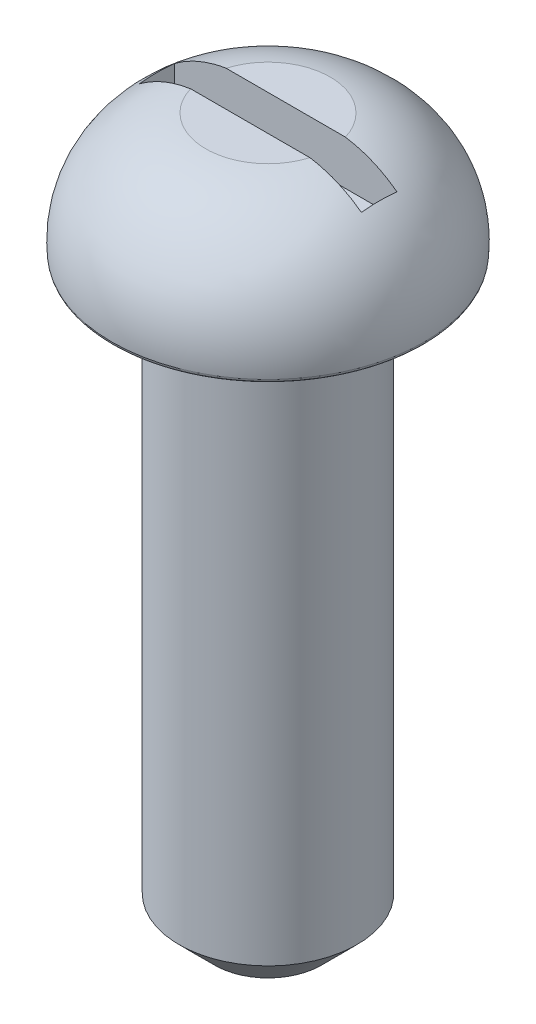
ISO-10303-21;
HEADER;
FILE_DESCRIPTION(('STEP AP214'),'2;1');
FILE_NAME('part.step','',(''),(''),'','','');
FILE_SCHEMA(('AUTOMOTIVE_DESIGN { 1 0 10303 214 1 1 1 1 }'));
ENDSEC;
DATA;
#1=APPLICATION_CONTEXT('core data for automotive mechanical design processes');
#2=APPLICATION_PROTOCOL_DEFINITION('international standard','automotive_design',2000,#1);
#3=PRODUCT_CONTEXT('',#1,'mechanical');
#4=PRODUCT('Part','Part','',(#3));
#5=PRODUCT_RELATED_PRODUCT_CATEGORY('part','',(#4));
#6=PRODUCT_DEFINITION_FORMATION('','',#4);
#7=PRODUCT_DEFINITION_CONTEXT('part definition',#1,'design');
#8=PRODUCT_DEFINITION('design','',#6,#7);
#9=PRODUCT_DEFINITION_SHAPE('','',#8);
#10=(LENGTH_UNIT() NAMED_UNIT(*) SI_UNIT(.MILLI.,.METRE.));
#11=(NAMED_UNIT(*) PLANE_ANGLE_UNIT() SI_UNIT($,.RADIAN.));
#12=(NAMED_UNIT(*) SI_UNIT($,.STERADIAN.) SOLID_ANGLE_UNIT());
#13=UNCERTAINTY_MEASURE_WITH_UNIT(LENGTH_MEASURE(1.E-05),#10,'distance_accuracy_value','');
#14=(GEOMETRIC_REPRESENTATION_CONTEXT(3) GLOBAL_UNCERTAINTY_ASSIGNED_CONTEXT((#13)) GLOBAL_UNIT_ASSIGNED_CONTEXT((#10,
#11,#12)) REPRESENTATION_CONTEXT('',''));
#15=CARTESIAN_POINT('',(0.,0.,0.));
#16=DIRECTION('',(0.,0.,1.));
#17=DIRECTION('',(1.,0.,0.));
#18=AXIS2_PLACEMENT_3D('',#15,#16,#17);
#19=CARTESIAN_POINT('',(0.,16.,0.));
#20=DIRECTION('',(0.,1.,0.));
#21=DIRECTION('',(0.,0.,1.));
#22=AXIS2_PLACEMENT_3D('',#19,#20,#21);
#23=PLANE('',#22);
#24=DIRECTION('',(-1.,0.,0.));
#25=VECTOR('',#24,1.);
#26=CARTESIAN_POINT('',(-2.5,16.,-0.4));
#27=LINE('',#26,#25);
#28=CARTESIAN_POINT('',(1.34164078649987,16.,-0.4));
#29=VERTEX_POINT('',#28);
#30=CARTESIAN_POINT('',(-1.34164078649987,16.,-0.4));
#31=VERTEX_POINT('',#30);
#32=EDGE_CURVE('E104',#29,#31,#27,.T.);
#33=ORIENTED_EDGE('',*,*,#32,.F.);
#34=CARTESIAN_POINT('',(0.,16.,0.));
#35=DIRECTION('',(0.,-1.,0.));
#36=DIRECTION('',(0.,0.,-1.));
#37=AXIS2_PLACEMENT_3D('',#34,#35,#36);
#38=CIRCLE('',#37,1.4);
#39=EDGE_CURVE('E127',#31,#29,#38,.T.);
#40=ORIENTED_EDGE('',*,*,#39,.F.);
#41=EDGE_LOOP('',(#33,#40));
#42=FACE_BOUND('',#41,.T.);
#43=ADVANCED_FACE('F28',(#42),#23,.T.);
#44=CARTESIAN_POINT('',(1.2,0.,0.));
#45=DIRECTION('',(0.,-1.,0.));
#46=DIRECTION('',(0.,0.,-1.));
#47=AXIS2_PLACEMENT_3D('',#44,#45,#46);
#48=PLANE('',#47);
#49=CARTESIAN_POINT('',(0.,0.,0.));
#50=DIRECTION('',(0.,-1.,0.));
#51=DIRECTION('',(0.,0.,-1.));
#52=AXIS2_PLACEMENT_3D('',#49,#50,#51);
#53=CIRCLE('',#52,1.2);
#54=CARTESIAN_POINT('',(0.,0.,-1.2));
#55=VERTEX_POINT('',#54);
#56=EDGE_CURVE('E114',#55,#55,#53,.T.);
#57=ORIENTED_EDGE('',*,*,#56,.T.);
#58=EDGE_LOOP('',(#57));
#59=FACE_BOUND('',#58,.T.);
#60=ADVANCED_FACE('F30',(#59),#48,.T.);
#61=DIRECTION('',(1.,0.,0.));
#62=VECTOR('',#61,1.);
#63=CARTESIAN_POINT('',(-2.5,16.,0.4));
#64=LINE('',#63,#62);
#65=CARTESIAN_POINT('',(-1.34164078649987,16.,0.4));
#66=VERTEX_POINT('',#65);
#67=CARTESIAN_POINT('',(1.34164078649987,16.,0.4));
#68=VERTEX_POINT('',#67);
#69=EDGE_CURVE('E106',#66,#68,#64,.T.);
#70=ORIENTED_EDGE('',*,*,#69,.F.);
#71=EDGE_CURVE('E130',#68,#66,#38,.T.);
#72=ORIENTED_EDGE('',*,*,#71,.F.);
#73=EDGE_LOOP('',(#70,#72));
#74=FACE_BOUND('',#73,.T.);
#75=ADVANCED_FACE('F175',(#74),#23,.T.);
#76=CARTESIAN_POINT('',(0.,13.5125,0.));
#77=DIRECTION('',(0.,-1.,0.));
#78=DIRECTION('',(0.,0.,-1.));
#79=AXIS2_PLACEMENT_3D('',#76,#77,#78);
#80=DEGENERATE_TOROIDAL_SURFACE('',#79,1.,2.5194555463433,.T.);
#81=CARTESIAN_POINT('',(0.,15.9594687881132,-0.4));
#82=CARTESIAN_POINT('',(-0.0338382677614271,15.9594721754177,-0.4));
#83=CARTESIAN_POINT('',(-0.0676779641194355,15.9605534690235,-0.4));
#84=CARTESIAN_POINT('',(-0.135250580531708,15.9645271586809,-0.4));
#85=CARTESIAN_POINT('',(-0.168983458976541,15.9674201897673,-0.4));
#86=CARTESIAN_POINT('',(-0.236586103651418,15.9742723387306,-0.4));
#87=CARTESIAN_POINT('',(-0.270455020948054,15.9782392285523,-0.4));
#88=CARTESIAN_POINT('',(-0.338156940635543,15.9864955449094,-0.4));
#89=CARTESIAN_POINT('',(-0.37198993610578,15.9907850250498,-0.4));
#90=CARTESIAN_POINT('',(-0.455604149313947,16.0010989072908,-0.4));
#91=CARTESIAN_POINT('',(-0.505403039900188,16.0069905560453,-0.4));
#92=CARTESIAN_POINT('',(-0.605160163724098,16.0172184164192,-0.4));
#93=CARTESIAN_POINT('',(-0.655118370099626,16.021554877577,-0.4));
#94=CARTESIAN_POINT('',(-0.755158183029392,16.0281116283189,-0.4));
#95=CARTESIAN_POINT('',(-0.805239724114253,16.0303328670776,-0.4));
#96=CARTESIAN_POINT('',(-0.905451481224645,16.0323446383411,-0.4));
#97=CARTESIAN_POINT('',(-0.955581698913416,16.0321350846395,-0.4));
#98=CARTESIAN_POINT('',(-1.10519744004029,16.0275826093243,-0.4));
#99=CARTESIAN_POINT('',(-1.20460157264622,16.0193672135559,-0.4));
#100=CARTESIAN_POINT('',(-1.40192321413768,15.9918916724499,-0.4));
#101=CARTESIAN_POINT('',(-1.49984015178237,15.9726273880546,-0.4));
#102=CARTESIAN_POINT('',(-1.66562418126213,15.9299930807012,-0.4));
#103=CARTESIAN_POINT('',(-1.73418957692369,15.9093063038867,-0.4));
#104=CARTESIAN_POINT('',(-1.86931661924559,15.8623062089933,-0.4));
#105=CARTESIAN_POINT('',(-1.93587915382989,15.8359954273999,-0.4));
#106=CARTESIAN_POINT('',(-2.13232230422446,15.7485950153914,-0.4));
#107=CARTESIAN_POINT('',(-2.25860062073281,15.6791290253755,-0.4));
#108=CARTESIAN_POINT('',(-2.49744991030645,15.5198455931525,-0.4));
#109=CARTESIAN_POINT('',(-2.61002524010937,15.4300346455554,-0.4));
#110=CARTESIAN_POINT('',(-2.81813579673432,15.2326675848493,-0.4));
#111=CARTESIAN_POINT('',(-2.9136919776501,15.125133611118,-0.4));
#112=CARTESIAN_POINT('',(-3.084020861249,14.8967637441041,-0.4));
#113=CARTESIAN_POINT('',(-3.15903353936495,14.7761066918437,-0.4));
#114=CARTESIAN_POINT('',(-3.28766382741801,14.5238219313858,-0.4));
#115=CARTESIAN_POINT('',(-3.34127386321256,14.3921903593208,-0.4));
#116=CARTESIAN_POINT('',(-3.42530915106019,14.1223801199839,-0.4));
#117=CARTESIAN_POINT('',(-3.45583823753319,13.984233780706,-0.4));
#118=CARTESIAN_POINT('',(-3.49323058953172,13.7047946739299,-0.4));
#119=CARTESIAN_POINT('',(-3.50009745955316,13.5635023889581,-0.4));
#120=CARTESIAN_POINT('',(-3.48998437740454,13.2819727914454,-0.4));
#121=CARTESIAN_POINT('',(-3.47303776304047,13.1417342798249,-0.4));
#122=CARTESIAN_POINT('',(-3.41583978349254,12.8660706381648,-0.4));
#123=CARTESIAN_POINT('',(-3.37558477651419,12.7306462638152,-0.4));
#124=CARTESIAN_POINT('',(-3.27291000213663,12.4684418568154,-0.4));
#125=CARTESIAN_POINT('',(-3.21048499893456,12.3416638745886,-0.4));
#126=CARTESIAN_POINT('',(-3.0652995823894,12.1004253875458,-0.4));
#127=CARTESIAN_POINT('',(-2.98254846845238,11.9859592842568,-0.4));
#128=CARTESIAN_POINT('',(-2.79895170451084,11.772356227364,-0.4));
#129=CARTESIAN_POINT('',(-2.69808464515238,11.6732376723482,-0.4));
#130=CARTESIAN_POINT('',(-2.48109536029556,11.4931192895068,-0.4));
#131=CARTESIAN_POINT('',(-2.36495283010316,11.4121439725998,-0.4));
#132=CARTESIAN_POINT('',(-2.12003686955878,11.2702055463965,-0.4));
#133=CARTESIAN_POINT('',(-1.99119324147536,11.2093628035941,-0.4));
#134=CARTESIAN_POINT('',(-1.79208455400501,11.1348165249818,-0.4));
#135=CARTESIAN_POINT('',(-1.72482351761208,11.112770190514,-0.4));
#136=CARTESIAN_POINT('',(-1.58871399977606,11.074248069245,-0.4));
#137=CARTESIAN_POINT('',(-1.51986566275127,11.0577717777811,-0.4));
#138=CARTESIAN_POINT('',(-1.37991833917445,11.0301913167248,-0.4));
#139=CARTESIAN_POINT('',(-1.30880096493828,11.0191810623686,-0.4));
#140=CARTESIAN_POINT('',(-1.16590883388619,11.0028540264086,-0.4));
#141=CARTESIAN_POINT('',(-1.09413397404904,10.9975381529959,-0.4));
#142=CARTESIAN_POINT('',(-0.950184709290669,10.9923360188387,-0.4));
#143=CARTESIAN_POINT('',(-0.878009750752937,10.9924659131582,-0.4));
#144=CARTESIAN_POINT('',(-0.733868359233081,10.9976141000356,-0.4));
#145=CARTESIAN_POINT('',(-0.661901885229666,11.0026313546615,-0.4));
#146=CARTESIAN_POINT('',(-0.527362844770217,11.0154201147344,-0.4));
#147=CARTESIAN_POINT('',(-0.464745964796631,11.0227664151523,-0.4));
#148=CARTESIAN_POINT('',(-0.370921074758583,11.0343512736872,-0.4));
#149=CARTESIAN_POINT('',(-0.339674021780255,11.0383056106516,-0.4));
#150=CARTESIAN_POINT('',(-0.277140745039576,11.0459577789511,-0.4));
#151=CARTESIAN_POINT('',(-0.245854514991186,11.0496555616753,-0.4));
#152=CARTESIAN_POINT('',(-0.183022337538647,11.0562464425247,-0.4));
#153=CARTESIAN_POINT('',(-0.151475896905263,11.0591351211382,-0.4));
#154=CARTESIAN_POINT('',(-0.0882845194117593,11.0634407062094,-0.4));
#155=CARTESIAN_POINT('',(-0.0566396201019181,11.0648581178138,-0.4));
#156=CARTESIAN_POINT('',(0.00670900055783508,11.0658228744264,-0.4));
#157=CARTESIAN_POINT('',(0.0384127491098342,11.0653686014411,-0.4));
#158=CARTESIAN_POINT('',(0.10175584896248,11.0627217036994,-0.4));
#159=CARTESIAN_POINT('',(0.133395161231609,11.0605282297223,-0.4));
#160=CARTESIAN_POINT('',(0.197075668927696,11.0549206280494,-0.4));
#161=CARTESIAN_POINT('',(0.229115032813019,11.0514872303989,-0.4));
#162=CARTESIAN_POINT('',(0.293132454280715,11.0440721569489,-0.4));
#163=CARTESIAN_POINT('',(0.325110499752555,11.0400903822904,-0.4));
#164=CARTESIAN_POINT('',(0.389068757237887,11.032113224633,-0.4));
#165=CARTESIAN_POINT('',(0.421048969104995,11.0281178401912,-0.4));
#166=CARTESIAN_POINT('',(0.485051815385008,11.0204868263651,-0.4));
#167=CARTESIAN_POINT('',(0.517074449026822,11.0168511905303,-0.4));
#168=CARTESIAN_POINT('',(0.613199905067879,11.0068908859735,-0.4));
#169=CARTESIAN_POINT('',(0.677408550694874,11.0015058987141,-0.4));
#170=CARTESIAN_POINT('',(0.806040956986531,10.9944125710688,-0.4));
#171=CARTESIAN_POINT('',(0.870464712950284,10.9927041508571,-0.4));
#172=CARTESIAN_POINT('',(0.99836221309259,10.9934918122463,-0.4));
#173=CARTESIAN_POINT('',(1.06183615678955,10.9959271498236,-0.4));
#174=CARTESIAN_POINT('',(1.18845961005121,11.0051429318533,-0.4));
#175=CARTESIAN_POINT('',(1.25160909489982,11.0119237025194,-0.4));
#176=CARTESIAN_POINT('',(1.44046174579123,11.0390588425836,-0.4));
#177=CARTESIAN_POINT('',(1.56529661737748,11.0662059685067,-0.4));
#178=CARTESIAN_POINT('',(1.75532938071435,11.1225098666057,-0.4));
#179=CARTESIAN_POINT('',(1.82244963264302,11.1454497391749,-0.400000000000001));
#180=CARTESIAN_POINT('',(1.9544668245481,11.1967759205072,-0.400000000000001));
#181=CARTESIAN_POINT('',(2.0193672489669,11.2251531837482,-0.400000000000001));
#182=CARTESIAN_POINT('',(2.14746610091274,11.287655872903,-0.400000000000001));
#183=CARTESIAN_POINT('',(2.2106280791609,11.3218560714777,-0.400000000000001));
#184=CARTESIAN_POINT('',(2.33384141088278,11.3954981556499,-0.400000000000001));
#185=CARTESIAN_POINT('',(2.39389112687907,11.4349427623866,-0.400000000000001));
#186=CARTESIAN_POINT('',(2.56822105293428,11.5604414895362,-0.400000000000001));
#187=CARTESIAN_POINT('',(2.67727417342556,11.6539498739746,-0.400000000000001));
#188=CARTESIAN_POINT('',(2.87731664505904,11.8575381230657,-0.400000000000001));
#189=CARTESIAN_POINT('',(2.96839942775862,11.967526745611,-0.400000000000001));
#190=CARTESIAN_POINT('',(3.13011034367072,12.2005805767337,-0.400000000000001));
#191=CARTESIAN_POINT('',(3.2008690104347,12.3235550656091,-0.400000000000001));
#192=CARTESIAN_POINT('',(3.32076250094825,12.5798864015786,-0.400000000000001));
#193=CARTESIAN_POINT('',(3.36985981264247,12.7132607924853,-0.400000000000001));
#194=CARTESIAN_POINT('',(3.44466082174416,12.9857648809142,-0.400000000000001));
#195=CARTESIAN_POINT('',(3.47046942013737,13.1248657895259,-0.400000000000001));
#196=CARTESIAN_POINT('',(3.49832209574621,13.4053506959011,-0.400000000000001));
#197=CARTESIAN_POINT('',(3.50037915256109,13.5467334044125,-0.400000000000001));
#198=CARTESIAN_POINT('',(3.48071400899756,13.827680796085,-0.400000000000001));
#199=CARTESIAN_POINT('',(3.45901751439648,13.9672472794955,-0.400000000000001));
#200=CARTESIAN_POINT('',(3.39249967383479,14.2407968712602,-0.400000000000001));
#201=CARTESIAN_POINT('',(3.34767190795041,14.3747784183909,-0.400000000000001));
#202=CARTESIAN_POINT('',(3.23615362082009,14.6333685749116,-0.400000000000001));
#203=CARTESIAN_POINT('',(3.16945508114511,14.7579737260251,-0.400000000000001));
#204=CARTESIAN_POINT('',(3.01616115015904,14.994170437646,-0.400000000000001));
#205=CARTESIAN_POINT('',(2.92957716226703,15.1057694015433,-0.400000000000001));
#206=CARTESIAN_POINT('',(2.73884400908251,15.3130500055761,-0.400000000000001));
#207=CARTESIAN_POINT('',(2.63467263893206,15.4087112164015,-0.400000000000001));
#208=CARTESIAN_POINT('',(2.41166340004833,15.5814542600167,-0.400000000000001));
#209=CARTESIAN_POINT('',(2.29280072738464,15.6585040042624,-0.400000000000001));
#210=CARTESIAN_POINT('',(2.04300308130581,15.7922605207593,-0.400000000000001));
#211=CARTESIAN_POINT('',(1.9119902448074,15.8488227998933,-0.4));
#212=CARTESIAN_POINT('',(1.71029562555841,15.9167355419974,-0.4));
#213=CARTESIAN_POINT('',(1.64233860502261,15.9365291975628,-0.4));
#214=CARTESIAN_POINT('',(1.50500335369698,15.970535819594,-0.4));
#215=CARTESIAN_POINT('',(1.43562462691051,15.9847468022932,-0.4));
#216=CARTESIAN_POINT('',(1.27838918164239,16.0104556218676,-0.4));
#217=CARTESIAN_POINT('',(1.19027247123466,16.0203729092839,-0.4));
#218=CARTESIAN_POINT('',(1.01355864413965,16.031745217942,-0.4));
#219=CARTESIAN_POINT('',(0.924961815219313,16.0332048448398,-0.4));
#220=CARTESIAN_POINT('',(0.791965647083485,16.0297457589619,-0.4));
#221=CARTESIAN_POINT('',(0.747467524576745,16.0276346462116,-0.4));
#222=CARTESIAN_POINT('',(0.658580235401709,16.021753448913,-0.4));
#223=CARTESIAN_POINT('',(0.614191070131046,16.0179833431949,-0.4));
#224=CARTESIAN_POINT('',(0.525521437051814,16.0091681976184,-0.4));
#225=CARTESIAN_POINT('',(0.481241040864893,16.004122470548,-0.4));
#226=CARTESIAN_POINT('',(0.392755822811415,15.9934177415786,-0.4));
#227=CARTESIAN_POINT('',(0.348551004111985,15.9877587145892,-0.4));
#228=CARTESIAN_POINT('',(0.278970443467472,15.9792802111881,-0.4));
#229=CARTESIAN_POINT('',(0.253617379606738,15.976280354131,-0.4));
#230=CARTESIAN_POINT('',(0.202862030439123,15.9707658833481,-0.4));
#231=CARTESIAN_POINT('',(0.177459757037158,15.9682511642246,-0.4));
#232=CARTESIAN_POINT('',(0.126738568217447,15.9640518042722,-0.4));
#233=CARTESIAN_POINT('',(0.10142008431906,15.9623622119908,-0.4));
#234=CARTESIAN_POINT('',(0.0507346632318588,15.9600695076987,-0.4));
#235=CARTESIAN_POINT('',(0.0253677330615122,15.9594662487327,-0.4));
#236=CARTESIAN_POINT('',(0.,15.9594687881132,-0.4));
#237=B_SPLINE_CURVE_WITH_KNOTS('',3,(#81,#82,#83,#84,#85,#86,#87,#88,#89,#90,#91,#92,#93,#94,
#95,#96,#97,#98,#99,#100,#101,#102,#103,#104,#105,#106,#107,#108,#109,#110,#111,#112,#113,#114,
#115,#116,#117,#118,#119,#120,#121,#122,#123,#124,#125,#126,#127,#128,#129,#130,#131,#132,#133,
#134,#135,#136,#137,#138,#139,#140,#141,#142,#143,#144,#145,#146,#147,#148,#149,#150,#151,#152,
#153,#154,#155,#156,#157,#158,#159,#160,#161,#162,#163,#164,#165,#166,#167,#168,#169,#170,#171,
#172,#173,#174,#175,#176,#177,#178,#179,#180,#181,#182,#183,#184,#185,#186,#187,#188,#189,#190,
#191,#192,#193,#194,#195,#196,#197,#198,#199,#200,#201,#202,#203,#204,#205,#206,#207,#208,#209,
#210,#211,#212,#213,#214,#215,#216,#217,#218,#219,#220,#221,#222,#223,#224,#225,#226,#227,#228,
#229,#230,#231,#232,#233,#234,#235,#236),.UNSPECIFIED.,.T.,.F.,(4,2,2,2,2,2,2,2,2,2,2,2,2,2,2,2,
2,2,2,2,2,2,2,2,2,2,2,2,2,2,2,2,2,2,2,2,2,2,2,2,2,2,2,2,2,2,2,2,2,2,2,2,2,2,2,2,2,2,2,2,2,2,2,2,
2,2,2,2,2,2,2,2,2,2,2,2,2,4),(0.,0.101504820932104,0.203045240398578,0.305341160156972,
0.407654116223659,0.558081783931965,0.708485303870073,0.8588213006085,1.00916262892524,
1.30776882315044,1.60648695227951,1.82109723915609,2.03561093798814,2.4657326568493,
2.89571726330221,3.32516875395587,3.74936604809478,4.17371332786318,4.59614004412969,
5.01850240874495,5.44027407379522,5.8621116558905,6.28404892806824,6.70579351796423,
7.12803984347598,7.55085321578287,7.97615061383829,8.18830163157114,8.40043342262915,
8.6160936898064,8.83178834730523,9.04812291583579,9.26441155126527,9.45352775460854,
9.54801820378475,9.64252650798969,9.73754139533282,9.83252364934071,9.92758802877956,
10.022698855065,10.1193563532496,10.2160312993006,10.3127168351883,10.4094006371196,
10.6026220243656,10.7958392163339,10.9862483442131,11.1766717678777,11.5583291965066,
11.7709265896662,11.9831733338554,12.1983855488727,12.4137098689357,12.8424067104954,
13.2688122625346,13.692414601143,14.1167476610478,14.5391596860364,14.9613408629158,
15.3830656121491,15.8049074711653,16.2269041622917,16.6486594586918,17.0709512775254,
17.4939660660107,17.9199087118788,18.1320569117541,18.3442804290728,18.6098634532941,
18.8753018395142,19.008919354105,19.1425385737906,19.2762299317647,19.4099267612036,
19.4865147484735,19.5630860779915,19.6391920897656,19.7152878054215),.UNSPECIFIED.);
#238=CARTESIAN_POINT('',(2.5,15.5128129281362,-0.400000000000001));
#239=VERTEX_POINT('',#238);
#240=EDGE_CURVE('E11',#239,#29,#237,.T.);
#241=ORIENTED_EDGE('',*,*,#240,.F.);
#242=CARTESIAN_POINT('',(2.5,15.5367668425877,0.));
#243=CARTESIAN_POINT('',(2.5,15.5367670015249,-0.091500264816902));
#244=CARTESIAN_POINT('',(2.5,15.5330519280067,-0.183007797475908));
#245=CARTESIAN_POINT('',(2.5,15.5180908020495,-0.365383970362098));
#246=CARTESIAN_POINT('',(2.5,15.5068432122217,-0.456252476337135));
#247=CARTESIAN_POINT('',(2.5,15.461362155303,-0.726544822515581));
#248=CARTESIAN_POINT('',(2.5,15.4153942264796,-0.904280473858294));
#249=CARTESIAN_POINT('',(2.5,15.3069506191006,-1.19748232639554));
#250=CARTESIAN_POINT('',(2.5,15.2530376109683,-1.31614405769195));
#251=CARTESIAN_POINT('',(2.5,15.126656167764,-1.54325305912053));
#252=CARTESIAN_POINT('',(2.5,15.0541987569766,-1.65170634576009));
#253=CARTESIAN_POINT('',(2.5,14.8902299193953,-1.8548043569158));
#254=CARTESIAN_POINT('',(2.5,14.7985618626584,-1.94932395558131));
#255=CARTESIAN_POINT('',(2.5,14.5983729261488,-2.11853619772126));
#256=CARTESIAN_POINT('',(2.5,14.4898632613297,-2.19324194635525));
#257=CARTESIAN_POINT('',(2.5,14.275575093763,-2.3097698044652));
#258=CARTESIAN_POINT('',(2.5,14.1714856021864,-2.35470691354324));
#259=CARTESIAN_POINT('',(2.5,13.9567699842453,-2.42442000934846));
#260=CARTESIAN_POINT('',(2.5,13.8461483261894,-2.44920961041039));
#261=CARTESIAN_POINT('',(2.5,13.6327053910413,-2.47608357714888));
#262=CARTESIAN_POINT('',(2.5,13.5301195153304,-2.48007087085806));
#263=CARTESIAN_POINT('',(2.5,13.3258092703255,-2.47031652720578));
#264=CARTESIAN_POINT('',(2.5,13.2240846925092,-2.45657931214316));
#265=CARTESIAN_POINT('',(2.5,13.0268160142359,-2.41248488240354));
#266=CARTESIAN_POINT('',(2.5,12.931183203771,-2.38252153712198));
#267=CARTESIAN_POINT('',(2.5,12.7460931871743,-2.30742528464294));
#268=CARTESIAN_POINT('',(2.5,12.6566363629631,-2.26229144031843));
#269=CARTESIAN_POINT('',(2.5,12.4833361297419,-2.15692413643585));
#270=CARTESIAN_POINT('',(2.5,12.3997500402724,-2.09626890754031));
#271=CARTESIAN_POINT('',(2.5,12.2429648945198,-1.96281078422356));
#272=CARTESIAN_POINT('',(2.5,12.1697680067488,-1.89000536060222));
#273=CARTESIAN_POINT('',(2.5,12.0289264329146,-1.72790867535516));
#274=CARTESIAN_POINT('',(2.5,11.9622958758047,-1.63773913873686));
#275=CARTESIAN_POINT('',(2.5,11.8427839181365,-1.44874918190837));
#276=CARTESIAN_POINT('',(2.5,11.7899107052323,-1.34992365665206));
#277=CARTESIAN_POINT('',(2.5,11.6776441076254,-1.10212490845805));
#278=CARTESIAN_POINT('',(2.5,11.6253136882517,-0.949942139465326));
#279=CARTESIAN_POINT('',(2.5,11.5459322266466,-0.639039136176456));
#280=CARTESIAN_POINT('',(2.5,11.5189387998828,-0.480304854809009));
#281=CARTESIAN_POINT('',(2.5,11.4879004512649,-0.157865091630426));
#282=CARTESIAN_POINT('',(2.5,11.4842658381049,0.00587876292039826));
#283=CARTESIAN_POINT('',(2.5,11.5006814189312,0.332122170327457));
#284=CARTESIAN_POINT('',(2.5,11.520714470928,0.49462253806139));
#285=CARTESIAN_POINT('',(2.5,11.5827239177504,0.797277045413252));
#286=CARTESIAN_POINT('',(2.5,11.6221064017617,0.937953830788707));
#287=CARTESIAN_POINT('',(2.5,11.7230465774401,1.21111704379188));
#288=CARTESIAN_POINT('',(2.5,11.7845703220912,1.34361564786348));
#289=CARTESIAN_POINT('',(2.5,11.9177233191766,1.57250786917698));
#290=CARTESIAN_POINT('',(2.5,11.985543898468,1.67110875342554));
#291=CARTESIAN_POINT('',(2.5,12.1366125292409,1.85580706618106));
#292=CARTESIAN_POINT('',(2.5,12.2198577567511,1.94190677828607));
#293=CARTESIAN_POINT('',(2.5,12.4009748654164,2.0984087573094));
#294=CARTESIAN_POINT('',(2.5,12.4989323028123,2.16871276558768));
#295=CARTESIAN_POINT('',(2.5,12.7064469321812,2.28944621439156));
#296=CARTESIAN_POINT('',(2.5,12.8159983238678,2.33988553385618));
#297=CARTESIAN_POINT('',(2.5,13.0304039926848,2.41388256230386));
#298=CARTESIAN_POINT('',(2.5,13.1344531251417,2.43978388133006));
#299=CARTESIAN_POINT('',(2.5,13.3454957286838,2.47254011541879));
#300=CARTESIAN_POINT('',(2.5,13.4524878924767,2.47940335349104));
#301=CARTESIAN_POINT('',(2.5,13.6596624673535,2.47395032082968));
#302=CARTESIAN_POINT('',(2.5,13.7598758808131,2.46273645676311));
#303=CARTESIAN_POINT('',(2.5,13.9569791779968,2.42364412292458));
#304=CARTESIAN_POINT('',(2.5,14.053869426513,2.39576748849706));
#305=CARTESIAN_POINT('',(2.5,14.2418158126943,2.32442672746202));
#306=CARTESIAN_POINT('',(2.5,14.3328658945149,2.2809467196809));
#307=CARTESIAN_POINT('',(2.5,14.5068611882592,2.18005488429901));
#308=CARTESIAN_POINT('',(2.5,14.5898051134108,2.12264084983198));
#309=CARTESIAN_POINT('',(2.5,14.7501522532948,1.99249036295088));
#310=CARTESIAN_POINT('',(2.5,14.8270218533704,1.91909863435174));
#311=CARTESIAN_POINT('',(2.5,14.9688300237409,1.76162591724045));
#312=CARTESIAN_POINT('',(2.5,15.033765096437,1.67754180733593));
#313=CARTESIAN_POINT('',(2.5,15.1579498910983,1.49117286112959));
#314=CARTESIAN_POINT('',(2.5,15.2157195955857,1.38790535829524));
#315=CARTESIAN_POINT('',(2.5,15.3162174418205,1.1743543810094));
#316=CARTESIAN_POINT('',(2.5,15.3589365686593,1.06406674821159));
#317=CARTESIAN_POINT('',(2.5,15.4430915918001,0.798248126082747));
#318=CARTESIAN_POINT('',(2.5,15.4784756070002,0.640780050388827));
#319=CARTESIAN_POINT('',(2.5,15.5135874587563,0.402013236836231));
#320=CARTESIAN_POINT('',(2.5,15.52229683123,0.321862262979064));
#321=CARTESIAN_POINT('',(2.5,15.5338856326612,0.161142655354649));
#322=CARTESIAN_POINT('',(2.5,15.5367667026293,0.0805741455554352));
#323=CARTESIAN_POINT('',(2.5,15.5367668425877,0.));
#324=B_SPLINE_CURVE_WITH_KNOTS('',3,(#242,#243,#244,#245,#246,#247,#248,#249,#250,#251,#252,
#253,#254,#255,#256,#257,#258,#259,#260,#261,#262,#263,#264,#265,#266,#267,#268,#269,#270,#271,
#272,#273,#274,#275,#276,#277,#278,#279,#280,#281,#282,#283,#284,#285,#286,#287,#288,#289,#290,
#291,#292,#293,#294,#295,#296,#297,#298,#299,#300,#301,#302,#303,#304,#305,#306,#307,#308,#309,
#310,#311,#312,#313,#314,#315,#316,#317,#318,#319,#320,#321,#322,#323),.UNSPECIFIED.,.T.,.F.,(4,
2,2,2,2,2,2,2,2,2,2,2,2,2,2,2,2,2,2,2,2,2,2,2,2,2,2,2,2,2,2,2,2,2,2,2,2,2,2,2,4),(0.,
0.274415014586531,0.548886054437859,1.09597501657236,1.48555741429441,1.87490874869223,
2.26756751275134,2.65996591542711,2.99822121841734,3.33624776067343,3.64273043744199,
3.94913666098119,4.24841843240524,4.54771869475692,4.8562256713324,5.16479694740183,
5.49982491015698,5.83505181036272,6.31520170952834,6.79644082691913,7.28611055366777,
7.77542584029954,8.21207460177579,8.64805672506248,9.00561192257923,9.36310172283598,
9.72275727557959,10.0822337409247,10.4022372415518,10.722100821967,11.0231846135131,
11.324235247868,11.6255931658266,11.9269988439299,12.2445251339688,12.5621443321505,
12.9157856276996,13.269638386591,13.7514678815871,13.9931828479188,14.2348297477626),.UNSPECIFIED.);
#325=CARTESIAN_POINT('',(2.5,15.5128129281341,0.4));
#326=VERTEX_POINT('',#325);
#327=EDGE_CURVE('E32',#326,#239,#324,.T.);
#328=ORIENTED_EDGE('',*,*,#327,.F.);
#329=CARTESIAN_POINT('',(0.,15.9594687881132,0.4));
#330=CARTESIAN_POINT('',(0.0338382677614266,15.9594721754177,0.4));
#331=CARTESIAN_POINT('',(0.0676779641194351,15.9605534690235,0.4));
#332=CARTESIAN_POINT('',(0.135250580531707,15.9645271586809,0.4));
#333=CARTESIAN_POINT('',(0.16898345897654,15.9674201897673,0.4));
#334=CARTESIAN_POINT('',(0.236586103651418,15.9742723387306,0.4));
#335=CARTESIAN_POINT('',(0.270455020948054,15.9782392285523,0.4));
#336=CARTESIAN_POINT('',(0.338156940635543,15.9864955449094,0.4));
#337=CARTESIAN_POINT('',(0.371989936105779,15.9907850250498,0.4));
#338=CARTESIAN_POINT('',(0.455604149313946,16.0010989072908,0.4));
#339=CARTESIAN_POINT('',(0.505403039900187,16.0069905560453,0.4));
#340=CARTESIAN_POINT('',(0.605160163724097,16.0172184164192,0.4));
#341=CARTESIAN_POINT('',(0.655118370099625,16.021554877577,0.4));
#342=CARTESIAN_POINT('',(0.755158183029391,16.0281116283189,0.4));
#343=CARTESIAN_POINT('',(0.805239724114252,16.0303328670776,0.4));
#344=CARTESIAN_POINT('',(0.905451481224645,16.0323446383411,0.4));
#345=CARTESIAN_POINT('',(0.955581698913415,16.0321350846395,0.4));
#346=CARTESIAN_POINT('',(1.10519744004029,16.0275826093243,0.4));
#347=CARTESIAN_POINT('',(1.20460157264622,16.0193672135559,0.4));
#348=CARTESIAN_POINT('',(1.40192321413768,15.9918916724499,0.4));
#349=CARTESIAN_POINT('',(1.49984015178237,15.9726273880546,0.4));
#350=CARTESIAN_POINT('',(1.66562418126213,15.9299930807012,0.4));
#351=CARTESIAN_POINT('',(1.73418957692369,15.9093063038867,0.4));
#352=CARTESIAN_POINT('',(1.86931661924559,15.8623062089933,0.4));
#353=CARTESIAN_POINT('',(1.93587915382989,15.8359954273999,0.4));
#354=CARTESIAN_POINT('',(2.13232230422446,15.7485950153914,0.4));
#355=CARTESIAN_POINT('',(2.25860062073281,15.6791290253755,0.4));
#356=CARTESIAN_POINT('',(2.49744991030645,15.5198455931525,0.4));
#357=CARTESIAN_POINT('',(2.61002524010937,15.4300346455554,0.4));
#358=CARTESIAN_POINT('',(2.81813579673432,15.2326675848493,0.4));
#359=CARTESIAN_POINT('',(2.9136919776501,15.125133611118,0.4));
#360=CARTESIAN_POINT('',(3.084020861249,14.8967637441041,0.4));
#361=CARTESIAN_POINT('',(3.15903353936495,14.7761066918437,0.4));
#362=CARTESIAN_POINT('',(3.28766382741801,14.5238219313858,0.4));
#363=CARTESIAN_POINT('',(3.34127386321256,14.3921903593208,0.4));
#364=CARTESIAN_POINT('',(3.42530915106019,14.1223801199838,0.4));
#365=CARTESIAN_POINT('',(3.45583823753319,13.984233780706,0.399999999999999));
#366=CARTESIAN_POINT('',(3.49323058953172,13.7047946739299,0.399999999999999));
#367=CARTESIAN_POINT('',(3.50009745955316,13.5635023889581,0.399999999999999));
#368=CARTESIAN_POINT('',(3.48998437740454,13.2819727914454,0.399999999999999));
#369=CARTESIAN_POINT('',(3.47303776304047,13.1417342798249,0.4));
#370=CARTESIAN_POINT('',(3.41583978349254,12.8660706381648,0.4));
#371=CARTESIAN_POINT('',(3.37558477651419,12.7306462638152,0.4));
#372=CARTESIAN_POINT('',(3.27291000213663,12.4684418568154,0.4));
#373=CARTESIAN_POINT('',(3.21048499893456,12.3416638745886,0.4));
#374=CARTESIAN_POINT('',(3.0652995823894,12.1004253875458,0.4));
#375=CARTESIAN_POINT('',(2.98254846845238,11.9859592842568,0.4));
#376=CARTESIAN_POINT('',(2.79895170451084,11.772356227364,0.4));
#377=CARTESIAN_POINT('',(2.69808464515238,11.6732376723482,0.4));
#378=CARTESIAN_POINT('',(2.48109536029556,11.4931192895068,0.4));
#379=CARTESIAN_POINT('',(2.36495283010316,11.4121439725998,0.4));
#380=CARTESIAN_POINT('',(2.12003686955878,11.2702055463965,0.4));
#381=CARTESIAN_POINT('',(1.99119324147536,11.2093628035941,0.4));
#382=CARTESIAN_POINT('',(1.79208455400501,11.1348165249818,0.4));
#383=CARTESIAN_POINT('',(1.72482351761208,11.112770190514,0.4));
#384=CARTESIAN_POINT('',(1.58871399977606,11.074248069245,0.4));
#385=CARTESIAN_POINT('',(1.51986566275127,11.0577717777811,0.4));
#386=CARTESIAN_POINT('',(1.37991833917445,11.0301913167248,0.4));
#387=CARTESIAN_POINT('',(1.30880096493828,11.0191810623686,0.4));
#388=CARTESIAN_POINT('',(1.16590883388619,11.0028540264086,0.4));
#389=CARTESIAN_POINT('',(1.09413397404904,10.9975381529959,0.4));
#390=CARTESIAN_POINT('',(0.950184709290667,10.9923360188387,0.4));
#391=CARTESIAN_POINT('',(0.878009750752936,10.9924659131582,0.4));
#392=CARTESIAN_POINT('',(0.733868359233081,10.9976141000356,0.4));
#393=CARTESIAN_POINT('',(0.661901885229666,11.0026313546615,0.4));
#394=CARTESIAN_POINT('',(0.527362844770217,11.0154201147344,0.4));
#395=CARTESIAN_POINT('',(0.46474596479663,11.0227664151523,0.4));
#396=CARTESIAN_POINT('',(0.370921074758583,11.0343512736872,0.4));
#397=CARTESIAN_POINT('',(0.339674021780254,11.0383056106516,0.4));
#398=CARTESIAN_POINT('',(0.277140745039576,11.0459577789511,0.4));
#399=CARTESIAN_POINT('',(0.245854514991185,11.0496555616753,0.4));
#400=CARTESIAN_POINT('',(0.183022337538647,11.0562464425247,0.4));
#401=CARTESIAN_POINT('',(0.151475896905263,11.0591351211382,0.4));
#402=CARTESIAN_POINT('',(0.0882845194117591,11.0634407062094,0.4));
#403=CARTESIAN_POINT('',(0.0566396201019179,11.0648581178138,0.4));
#404=CARTESIAN_POINT('',(-0.0067090005578355,11.0658228744264,0.4));
#405=CARTESIAN_POINT('',(-0.0384127491098349,11.0653686014411,0.4));
#406=CARTESIAN_POINT('',(-0.101755848962481,11.0627217036994,0.4));
#407=CARTESIAN_POINT('',(-0.13339516123161,11.0605282297223,0.4));
#408=CARTESIAN_POINT('',(-0.197075668927696,11.0549206280494,0.4));
#409=CARTESIAN_POINT('',(-0.22911503281302,11.0514872303989,0.4));
#410=CARTESIAN_POINT('',(-0.293132454280717,11.0440721569489,0.4));
#411=CARTESIAN_POINT('',(-0.325110499752556,11.0400903822904,0.4));
#412=CARTESIAN_POINT('',(-0.389068757237889,11.032113224633,0.4));
#413=CARTESIAN_POINT('',(-0.421048969104997,11.0281178401912,0.4));
#414=CARTESIAN_POINT('',(-0.485051815385009,11.0204868263651,0.4));
#415=CARTESIAN_POINT('',(-0.517074449026823,11.0168511905303,0.4));
#416=CARTESIAN_POINT('',(-0.613199905067879,11.0068908859735,0.4));
#417=CARTESIAN_POINT('',(-0.677408550694873,11.0015058987141,0.4));
#418=CARTESIAN_POINT('',(-0.80604095698653,10.9944125710688,0.4));
#419=CARTESIAN_POINT('',(-0.870464712950283,10.9927041508571,0.4));
#420=CARTESIAN_POINT('',(-0.998362213092589,10.9934918122463,0.4));
#421=CARTESIAN_POINT('',(-1.06183615678955,10.9959271498236,0.4));
#422=CARTESIAN_POINT('',(-1.18845961005121,11.0051429318533,0.4));
#423=CARTESIAN_POINT('',(-1.25160909489982,11.0119237025194,0.4));
#424=CARTESIAN_POINT('',(-1.44046174579123,11.0390588425836,0.4));
#425=CARTESIAN_POINT('',(-1.56529661737748,11.0662059685067,0.4));
#426=CARTESIAN_POINT('',(-1.75532938071435,11.1225098666057,0.4));
#427=CARTESIAN_POINT('',(-1.82244963264302,11.1454497391749,0.4));
#428=CARTESIAN_POINT('',(-1.9544668245481,11.1967759205072,0.4));
#429=CARTESIAN_POINT('',(-2.0193672489669,11.2251531837482,0.4));
#430=CARTESIAN_POINT('',(-2.14746610091274,11.287655872903,0.4));
#431=CARTESIAN_POINT('',(-2.2106280791609,11.3218560714777,0.4));
#432=CARTESIAN_POINT('',(-2.33384141088278,11.3954981556499,0.4));
#433=CARTESIAN_POINT('',(-2.39389112687907,11.4349427623866,0.4));
#434=CARTESIAN_POINT('',(-2.56822105293428,11.5604414895362,0.4));
#435=CARTESIAN_POINT('',(-2.67727417342556,11.6539498739746,0.4));
#436=CARTESIAN_POINT('',(-2.87731664505904,11.8575381230657,0.4));
#437=CARTESIAN_POINT('',(-2.96839942775861,11.967526745611,0.4));
#438=CARTESIAN_POINT('',(-3.13011034367072,12.2005805767337,0.4));
#439=CARTESIAN_POINT('',(-3.2008690104347,12.3235550656091,0.4));
#440=CARTESIAN_POINT('',(-3.32076250094825,12.5798864015786,0.4));
#441=CARTESIAN_POINT('',(-3.36985981264247,12.7132607924853,0.4));
#442=CARTESIAN_POINT('',(-3.44466082174416,12.9857648809142,0.4));
#443=CARTESIAN_POINT('',(-3.47046942013737,13.1248657895259,0.400000000000001));
#444=CARTESIAN_POINT('',(-3.49832209574621,13.4053506959011,0.400000000000001));
#445=CARTESIAN_POINT('',(-3.50037915256109,13.5467334044125,0.400000000000001));
#446=CARTESIAN_POINT('',(-3.48071400899756,13.827680796085,0.400000000000001));
#447=CARTESIAN_POINT('',(-3.45901751439648,13.9672472794955,0.4));
#448=CARTESIAN_POINT('',(-3.39249967383479,14.2407968712602,0.4));
#449=CARTESIAN_POINT('',(-3.34767190795041,14.3747784183909,0.4));
#450=CARTESIAN_POINT('',(-3.2361536208201,14.6333685749116,0.4));
#451=CARTESIAN_POINT('',(-3.16945508114511,14.7579737260251,0.4));
#452=CARTESIAN_POINT('',(-3.01616115015904,14.9941704376459,0.4));
#453=CARTESIAN_POINT('',(-2.92957716226703,15.1057694015433,0.4));
#454=CARTESIAN_POINT('',(-2.73884400908251,15.3130500055761,0.4));
#455=CARTESIAN_POINT('',(-2.63467263893207,15.4087112164015,0.4));
#456=CARTESIAN_POINT('',(-2.41166340004833,15.5814542600167,0.4));
#457=CARTESIAN_POINT('',(-2.29280072738464,15.6585040042624,0.4));
#458=CARTESIAN_POINT('',(-2.04300308130581,15.7922605207593,0.4));
#459=CARTESIAN_POINT('',(-1.9119902448074,15.8488227998933,0.4));
#460=CARTESIAN_POINT('',(-1.71029562555841,15.9167355419974,0.4));
#461=CARTESIAN_POINT('',(-1.64233860502261,15.9365291975628,0.4));
#462=CARTESIAN_POINT('',(-1.50500335369698,15.970535819594,0.4));
#463=CARTESIAN_POINT('',(-1.43562462691051,15.9847468022932,0.4));
#464=CARTESIAN_POINT('',(-1.2783891816424,16.0104556218676,0.4));
#465=CARTESIAN_POINT('',(-1.19027247123467,16.0203729092839,0.4));
#466=CARTESIAN_POINT('',(-1.01355864413965,16.031745217942,0.4));
#467=CARTESIAN_POINT('',(-0.924961815219317,16.0332048448398,0.4));
#468=CARTESIAN_POINT('',(-0.791965647083489,16.0297457589619,0.4));
#469=CARTESIAN_POINT('',(-0.747467524576749,16.0276346462116,0.4));
#470=CARTESIAN_POINT('',(-0.658580235401713,16.021753448913,0.4));
#471=CARTESIAN_POINT('',(-0.61419107013105,16.0179833431949,0.4));
#472=CARTESIAN_POINT('',(-0.525521437051817,16.0091681976184,0.4));
#473=CARTESIAN_POINT('',(-0.481241040864897,16.004122470548,0.4));
#474=CARTESIAN_POINT('',(-0.392755822811418,15.9934177415786,0.4));
#475=CARTESIAN_POINT('',(-0.348551004111988,15.9877587145892,0.4));
#476=CARTESIAN_POINT('',(-0.278970443467475,15.9792802111881,0.4));
#477=CARTESIAN_POINT('',(-0.253617379606741,15.976280354131,0.4));
#478=CARTESIAN_POINT('',(-0.202862030439126,15.9707658833481,0.4));
#479=CARTESIAN_POINT('',(-0.177459757037161,15.9682511642246,0.4));
#480=CARTESIAN_POINT('',(-0.126738568217449,15.9640518042722,0.4));
#481=CARTESIAN_POINT('',(-0.101420084319061,15.9623622119908,0.4));
#482=CARTESIAN_POINT('',(-0.0507346632318591,15.9600695076987,0.4));
#483=CARTESIAN_POINT('',(-0.0253677330615125,15.9594662487327,0.4));
#484=CARTESIAN_POINT('',(0.,15.9594687881132,0.4));
#485=B_SPLINE_CURVE_WITH_KNOTS('',3,(#329,#330,#331,#332,#333,#334,#335,#336,#337,#338,#339,
#340,#341,#342,#343,#344,#345,#346,#347,#348,#349,#350,#351,#352,#353,#354,#355,#356,#357,#358,
#359,#360,#361,#362,#363,#364,#365,#366,#367,#368,#369,#370,#371,#372,#373,#374,#375,#376,#377,
#378,#379,#380,#381,#382,#383,#384,#385,#386,#387,#388,#389,#390,#391,#392,#393,#394,#395,#396,
#397,#398,#399,#400,#401,#402,#403,#404,#405,#406,#407,#408,#409,#410,#411,#412,#413,#414,#415,
#416,#417,#418,#419,#420,#421,#422,#423,#424,#425,#426,#427,#428,#429,#430,#431,#432,#433,#434,
#435,#436,#437,#438,#439,#440,#441,#442,#443,#444,#445,#446,#447,#448,#449,#450,#451,#452,#453,
#454,#455,#456,#457,#458,#459,#460,#461,#462,#463,#464,#465,#466,#467,#468,#469,#470,#471,#472,
#473,#474,#475,#476,#477,#478,#479,#480,#481,#482,#483,#484),.UNSPECIFIED.,.T.,.F.,(4,2,2,2,2,2,
2,2,2,2,2,2,2,2,2,2,2,2,2,2,2,2,2,2,2,2,2,2,2,2,2,2,2,2,2,2,2,2,2,2,2,2,2,2,2,2,2,2,2,2,2,2,2,2,
2,2,2,2,2,2,2,2,2,2,2,2,2,2,2,2,2,2,2,2,2,2,2,4),(0.,0.101504820932103,0.203045240398578,
0.305341160156973,0.407654116223659,0.558081783931964,0.708485303870073,0.8588213006085,
1.00916262892524,1.30776882315044,1.60648695227951,1.82109723915609,2.03561093798814,
2.4657326568493,2.89571726330221,3.32516875395587,3.74936604809479,4.17371332786318,
4.5961400441297,5.01850240874495,5.44027407379522,5.8621116558905,6.28404892806824,
6.70579351796423,7.12803984347598,7.55085321578287,7.97615061383829,8.18830163157114,
8.40043342262916,8.6160936898064,8.83178834730523,9.04812291583579,9.26441155126527,
9.45352775460854,9.54801820378475,9.64252650798969,9.73754139533282,9.83252364934071,
9.92758802877956,10.022698855065,10.1193563532496,10.2160312993006,10.3127168351883,
10.4094006371196,10.6026220243656,10.7958392163339,10.9862483442131,11.1766717678777,
11.5583291965066,11.7709265896662,11.9831733338554,12.1983855488727,12.4137098689357,
12.8424067104954,13.2688122625346,13.692414601143,14.1167476610478,14.5391596860364,
14.9613408629158,15.3830656121491,15.8049074711653,16.2269041622917,16.6486594586918,
17.0709512775254,17.4939660660107,17.9199087118788,18.1320569117541,18.3442804290728,
18.609863453294,18.8753018395141,19.008919354105,19.1425385737906,19.2762299317647,
19.4099267612036,19.4865147484735,19.5630860779915,19.6391920897656,19.7152878054215),.UNSPECIFIED.);
#486=EDGE_CURVE('E142',#68,#326,#485,.T.);
#487=ORIENTED_EDGE('',*,*,#486,.F.);
#488=ORIENTED_EDGE('',*,*,#71,.T.);
#489=CARTESIAN_POINT('',(-2.50000000000001,15.5128129281362,0.4));
#490=VERTEX_POINT('',#489);
#491=EDGE_CURVE('E137',#490,#66,#485,.T.);
#492=ORIENTED_EDGE('',*,*,#491,.F.);
#493=CARTESIAN_POINT('',(-2.5,15.5367668425877,0.));
#494=CARTESIAN_POINT('',(-2.5,15.5367670015249,0.0915002648169016));
#495=CARTESIAN_POINT('',(-2.5,15.5330519280067,0.183007797475908));
#496=CARTESIAN_POINT('',(-2.5,15.5180908020495,0.365383970362097));
#497=CARTESIAN_POINT('',(-2.5,15.5068432122217,0.456252476337135));
#498=CARTESIAN_POINT('',(-2.5,15.461362155303,0.72654482251558));
#499=CARTESIAN_POINT('',(-2.5,15.4153942264796,0.904280473858293));
#500=CARTESIAN_POINT('',(-2.5,15.3069506191006,1.19748232639554));
#501=CARTESIAN_POINT('',(-2.5,15.2530376109683,1.31614405769195));
#502=CARTESIAN_POINT('',(-2.5,15.126656167764,1.54325305912053));
#503=CARTESIAN_POINT('',(-2.5,15.0541987569766,1.65170634576009));
#504=CARTESIAN_POINT('',(-2.5,14.8902299193953,1.8548043569158));
#505=CARTESIAN_POINT('',(-2.5,14.7985618626584,1.94932395558131));
#506=CARTESIAN_POINT('',(-2.5,14.5983729261488,2.11853619772125));
#507=CARTESIAN_POINT('',(-2.5,14.4898632613297,2.19324194635524));
#508=CARTESIAN_POINT('',(-2.5,14.275575093763,2.30976980446519));
#509=CARTESIAN_POINT('',(-2.5,14.1714856021864,2.35470691354324));
#510=CARTESIAN_POINT('',(-2.5,13.9567699842453,2.42442000934845));
#511=CARTESIAN_POINT('',(-2.5,13.8461483261894,2.44920961041039));
#512=CARTESIAN_POINT('',(-2.5,13.6327053910413,2.47608357714888));
#513=CARTESIAN_POINT('',(-2.5,13.5301195153304,2.48007087085806));
#514=CARTESIAN_POINT('',(-2.5,13.3258092703255,2.47031652720577));
#515=CARTESIAN_POINT('',(-2.5,13.2240846925092,2.45657931214316));
#516=CARTESIAN_POINT('',(-2.5,13.0268160142359,2.41248488240354));
#517=CARTESIAN_POINT('',(-2.5,12.931183203771,2.38252153712198));
#518=CARTESIAN_POINT('',(-2.5,12.7460931871743,2.30742528464294));
#519=CARTESIAN_POINT('',(-2.5,12.6566363629631,2.26229144031843));
#520=CARTESIAN_POINT('',(-2.5,12.4833361297419,2.15692413643585));
#521=CARTESIAN_POINT('',(-2.5,12.3997500402724,2.09626890754031));
#522=CARTESIAN_POINT('',(-2.5,12.2429648945198,1.96281078422355));
#523=CARTESIAN_POINT('',(-2.5,12.1697680067488,1.89000536060222));
#524=CARTESIAN_POINT('',(-2.5,12.0289264329146,1.72790867535516));
#525=CARTESIAN_POINT('',(-2.5,11.9622958758047,1.63773913873686));
#526=CARTESIAN_POINT('',(-2.5,11.8427839181365,1.44874918190837));
#527=CARTESIAN_POINT('',(-2.5,11.7899107052323,1.34992365665206));
#528=CARTESIAN_POINT('',(-2.5,11.6776441076254,1.10212490845805));
#529=CARTESIAN_POINT('',(-2.5,11.6253136882517,0.949942139465325));
#530=CARTESIAN_POINT('',(-2.5,11.5459322266466,0.639039136176455));
#531=CARTESIAN_POINT('',(-2.5,11.5189387998828,0.480304854809008));
#532=CARTESIAN_POINT('',(-2.5,11.4879004512649,0.157865091630424));
#533=CARTESIAN_POINT('',(-2.5,11.4842658381049,-0.00587876292039986));
#534=CARTESIAN_POINT('',(-2.5,11.5006814189312,-0.332122170327459));
#535=CARTESIAN_POINT('',(-2.5,11.520714470928,-0.494622538061392));
#536=CARTESIAN_POINT('',(-2.5,11.5827239177504,-0.797277045413254));
#537=CARTESIAN_POINT('',(-2.5,11.6221064017617,-0.937953830788709));
#538=CARTESIAN_POINT('',(-2.5,11.7230465774401,-1.21111704379188));
#539=CARTESIAN_POINT('',(-2.5,11.7845703220912,-1.34361564786348));
#540=CARTESIAN_POINT('',(-2.5,11.9177233191766,-1.57250786917698));
#541=CARTESIAN_POINT('',(-2.5,11.985543898468,-1.67110875342554));
#542=CARTESIAN_POINT('',(-2.5,12.1366125292409,-1.85580706618106));
#543=CARTESIAN_POINT('',(-2.5,12.2198577567511,-1.94190677828607));
#544=CARTESIAN_POINT('',(-2.5,12.4009748654164,-2.09840875730939));
#545=CARTESIAN_POINT('',(-2.5,12.4989323028123,-2.16871276558768));
#546=CARTESIAN_POINT('',(-2.5,12.7064469321812,-2.28944621439156));
#547=CARTESIAN_POINT('',(-2.5,12.8159983238678,-2.33988553385618));
#548=CARTESIAN_POINT('',(-2.5,13.0304039926848,-2.41388256230386));
#549=CARTESIAN_POINT('',(-2.5,13.1344531251417,-2.43978388133006));
#550=CARTESIAN_POINT('',(-2.5,13.3454957286838,-2.47254011541879));
#551=CARTESIAN_POINT('',(-2.5,13.4524878924767,-2.47940335349104));
#552=CARTESIAN_POINT('',(-2.5,13.6596624673535,-2.47395032082968));
#553=CARTESIAN_POINT('',(-2.5,13.7598758808131,-2.46273645676311));
#554=CARTESIAN_POINT('',(-2.5,13.9569791779968,-2.42364412292458));
#555=CARTESIAN_POINT('',(-2.5,14.053869426513,-2.39576748849706));
#556=CARTESIAN_POINT('',(-2.5,14.2418158126943,-2.32442672746202));
#557=CARTESIAN_POINT('',(-2.5,14.3328658945149,-2.2809467196809));
#558=CARTESIAN_POINT('',(-2.5,14.5068611882592,-2.18005488429901));
#559=CARTESIAN_POINT('',(-2.5,14.5898051134108,-2.12264084983198));
#560=CARTESIAN_POINT('',(-2.5,14.7501522532948,-1.99249036295088));
#561=CARTESIAN_POINT('',(-2.5,14.8270218533704,-1.91909863435175));
#562=CARTESIAN_POINT('',(-2.5,14.9688300237409,-1.76162591724046));
#563=CARTESIAN_POINT('',(-2.5,15.033765096437,-1.67754180733593));
#564=CARTESIAN_POINT('',(-2.5,15.1579498910983,-1.4911728611296));
#565=CARTESIAN_POINT('',(-2.5,15.2157195955857,-1.38790535829525));
#566=CARTESIAN_POINT('',(-2.5,15.3162174418205,-1.1743543810094));
#567=CARTESIAN_POINT('',(-2.5,15.3589365686593,-1.06406674821159));
#568=CARTESIAN_POINT('',(-2.5,15.4430915918001,-0.798248126082748));
#569=CARTESIAN_POINT('',(-2.5,15.4784756070002,-0.640780050388828));
#570=CARTESIAN_POINT('',(-2.5,15.5135874587563,-0.402013236836232));
#571=CARTESIAN_POINT('',(-2.5,15.52229683123,-0.321862262979064));
#572=CARTESIAN_POINT('',(-2.5,15.5338856326612,-0.16114265535465));
#573=CARTESIAN_POINT('',(-2.5,15.5367667026293,-0.0805741455554355));
#574=CARTESIAN_POINT('',(-2.5,15.5367668425877,0.));
#575=B_SPLINE_CURVE_WITH_KNOTS('',3,(#493,#494,#495,#496,#497,#498,#499,#500,#501,#502,#503,
#504,#505,#506,#507,#508,#509,#510,#511,#512,#513,#514,#515,#516,#517,#518,#519,#520,#521,#522,
#523,#524,#525,#526,#527,#528,#529,#530,#531,#532,#533,#534,#535,#536,#537,#538,#539,#540,#541,
#542,#543,#544,#545,#546,#547,#548,#549,#550,#551,#552,#553,#554,#555,#556,#557,#558,#559,#560,
#561,#562,#563,#564,#565,#566,#567,#568,#569,#570,#571,#572,#573,#574),.UNSPECIFIED.,.T.,.F.,(4,
2,2,2,2,2,2,2,2,2,2,2,2,2,2,2,2,2,2,2,2,2,2,2,2,2,2,2,2,2,2,2,2,2,2,2,2,2,2,2,4),(0.,
0.27441501458653,0.548886054437859,1.09597501657236,1.48555741429441,1.87490874869223,
2.26756751275134,2.65996591542711,2.99822121841734,3.33624776067343,3.64273043744199,
3.94913666098119,4.24841843240524,4.54771869475692,4.8562256713324,5.16479694740183,
5.49982491015698,5.83505181036272,6.31520170952833,6.79644082691913,7.28611055366777,
7.77542584029954,8.21207460177579,8.64805672506248,9.00561192257922,9.36310172283597,
9.72275727557959,10.0822337409247,10.4022372415518,10.722100821967,11.0231846135131,
11.324235247868,11.6255931658266,11.9269988439299,12.2445251339687,12.5621443321505,
12.9157856276995,13.269638386591,13.7514678815871,13.9931828479188,14.2348297477626),.UNSPECIFIED.);
#576=CARTESIAN_POINT('',(-2.5,15.5128129281341,-0.4));
#577=VERTEX_POINT('',#576);
#578=EDGE_CURVE('E88',#577,#490,#575,.T.);
#579=ORIENTED_EDGE('',*,*,#578,.F.);
#580=EDGE_CURVE('E41',#31,#577,#237,.T.);
#581=ORIENTED_EDGE('',*,*,#580,.F.);
#582=ORIENTED_EDGE('',*,*,#39,.T.);
#583=EDGE_LOOP('',(#241,#328,#487,#488,#492,#579,#581,#582));
#584=FACE_BOUND('',#583,.T.);
#585=CARTESIAN_POINT('',(0.,13.2912170322649,0.));
#586=DIRECTION('',(0.,1.,0.));
#587=DIRECTION('',(0.,0.,1.));
#588=AXIS2_PLACEMENT_3D('',#585,#586,#587);
#589=CIRCLE('',#588,3.50971912735078);
#590=CARTESIAN_POINT('',(0.,13.2912170322649,3.50971912735078));
#591=VERTEX_POINT('',#590);
#592=EDGE_CURVE('E134',#591,#591,#589,.T.);
#593=ORIENTED_EDGE('',*,*,#592,.T.);
#594=EDGE_LOOP('',(#593));
#595=FACE_BOUND('',#594,.T.);
#596=ADVANCED_FACE('F146',(#584,#595),#80,.T.);
#597=CARTESIAN_POINT('',(3.5,13.2,0.));
#598=DIRECTION('',(0.,-1.,0.));
#599=DIRECTION('',(0.,0.,-1.));
#600=AXIS2_PLACEMENT_3D('',#597,#598,#599);
#601=PLANE('',#600);
#602=CARTESIAN_POINT('',(0.,13.2,0.));
#603=DIRECTION('',(0.,-1.,0.));
#604=DIRECTION('',(0.,0.,-1.));
#605=AXIS2_PLACEMENT_3D('',#602,#603,#604);
#606=CIRCLE('',#605,3.41010557667737);
#607=CARTESIAN_POINT('',(0.,13.2,-3.41010557667737));
#608=VERTEX_POINT('',#607);
#609=EDGE_CURVE('E131',#608,#608,#606,.T.);
#610=ORIENTED_EDGE('',*,*,#609,.T.);
#611=EDGE_LOOP('',(#610));
#612=FACE_BOUND('',#611,.T.);
#613=CARTESIAN_POINT('',(0.,13.2,0.));
#614=DIRECTION('',(0.,-1.,0.));
#615=DIRECTION('',(0.,0.,-1.));
#616=AXIS2_PLACEMENT_3D('',#613,#614,#615);
#617=CIRCLE('',#616,2.);
#618=CARTESIAN_POINT('',(0.,13.2,-2.));
#619=VERTEX_POINT('',#618);
#620=EDGE_CURVE('E124',#619,#619,#617,.T.);
#621=ORIENTED_EDGE('',*,*,#620,.F.);
#622=EDGE_LOOP('',(#621));
#623=FACE_BOUND('',#622,.T.);
#624=ADVANCED_FACE('F168',(#612,#623),#601,.T.);
#625=CARTESIAN_POINT('',(0.,0.,0.));
#626=DIRECTION('',(0.,-1.,0.));
#627=DIRECTION('',(0.,0.,-1.));
#628=AXIS2_PLACEMENT_3D('',#625,#626,#627);
#629=CYLINDRICAL_SURFACE('',#628,2.);
#630=ORIENTED_EDGE('',*,*,#620,.T.);
#631=EDGE_LOOP('',(#630));
#632=FACE_BOUND('',#631,.T.);
#633=CARTESIAN_POINT('',(0.,0.800000000000005,0.));
#634=DIRECTION('',(0.,-1.,0.));
#635=DIRECTION('',(0.,0.,-1.));
#636=AXIS2_PLACEMENT_3D('',#633,#634,#635);
#637=CIRCLE('',#636,2.);
#638=CARTESIAN_POINT('',(0.,0.800000000000005,-2.));
#639=VERTEX_POINT('',#638);
#640=EDGE_CURVE('E121',#639,#639,#637,.T.);
#641=ORIENTED_EDGE('',*,*,#640,.F.);
#642=EDGE_LOOP('',(#641));
#643=FACE_BOUND('',#642,.T.);
#644=ADVANCED_FACE('F165',(#632,#643),#629,.T.);
#645=CARTESIAN_POINT('',(0.,0.,0.));
#646=DIRECTION('',(0.,1.,0.));
#647=DIRECTION('',(0.,0.,1.));
#648=AXIS2_PLACEMENT_3D('',#645,#646,#647);
#649=CONICAL_SURFACE('',#648,1.2,0.785398163397446);
#650=ORIENTED_EDGE('',*,*,#640,.T.);
#651=EDGE_LOOP('',(#650));
#652=FACE_BOUND('',#651,.T.);
#653=ORIENTED_EDGE('',*,*,#56,.F.);
#654=EDGE_LOOP('',(#653));
#655=FACE_BOUND('',#654,.T.);
#656=ADVANCED_FACE('F161',(#652,#655),#649,.T.);
#657=CARTESIAN_POINT('',(0.,13.3,0.));
#658=DIRECTION('',(0.,-1.,0.));
#659=DIRECTION('',(0.,0.,-1.));
#660=AXIS2_PLACEMENT_3D('',#657,#658,#659);
#661=TOROIDAL_SURFACE('',#660,3.41010557667737,0.1);
#662=ORIENTED_EDGE('',*,*,#592,.F.);
#663=EDGE_LOOP('',(#662));
#664=FACE_BOUND('',#663,.T.);
#665=ORIENTED_EDGE('',*,*,#609,.F.);
#666=EDGE_LOOP('',(#665));
#667=FACE_BOUND('',#666,.T.);
#668=ADVANCED_FACE('F158',(#664,#667),#661,.T.);
#669=CARTESIAN_POINT('',(-2.5,15.,-0.4));
#670=DIRECTION('',(-1.,0.,0.));
#671=DIRECTION('',(0.,0.,1.));
#672=AXIS2_PLACEMENT_3D('',#669,#670,#671);
#673=PLANE('',#672);
#674=ORIENTED_EDGE('',*,*,#578,.T.);
#675=DIRECTION('',(0.,1.,0.));
#676=VECTOR('',#675,1.);
#677=CARTESIAN_POINT('',(-2.5,15.,0.4));
#678=LINE('',#677,#676);
#679=CARTESIAN_POINT('',(-2.5,15.,0.4));
#680=VERTEX_POINT('',#679);
#681=EDGE_CURVE('E48',#680,#490,#678,.T.);
#682=ORIENTED_EDGE('',*,*,#681,.F.);
#683=DIRECTION('',(0.,0.,1.));
#684=VECTOR('',#683,1.);
#685=CARTESIAN_POINT('',(-2.5,15.,-0.4));
#686=LINE('',#685,#684);
#687=CARTESIAN_POINT('',(-2.5,15.,-0.4));
#688=VERTEX_POINT('',#687);
#689=EDGE_CURVE('E85',#688,#680,#686,.T.);
#690=ORIENTED_EDGE('',*,*,#689,.F.);
#691=DIRECTION('',(0.,1.,0.));
#692=VECTOR('',#691,1.);
#693=CARTESIAN_POINT('',(-2.5,15.,-0.4));
#694=LINE('',#693,#692);
#695=EDGE_CURVE('E112',#688,#577,#694,.T.);
#696=ORIENTED_EDGE('',*,*,#695,.T.);
#697=EDGE_LOOP('',(#674,#682,#690,#696));
#698=FACE_BOUND('',#697,.T.);
#699=ADVANCED_FACE('F83',(#698),#673,.F.);
#700=CARTESIAN_POINT('',(-2.5,15.,-0.4));
#701=DIRECTION('',(0.,0.,-1.));
#702=DIRECTION('',(-1.,0.,0.));
#703=AXIS2_PLACEMENT_3D('',#700,#701,#702);
#704=PLANE('',#703);
#705=ORIENTED_EDGE('',*,*,#580,.T.);
#706=ORIENTED_EDGE('',*,*,#695,.F.);
#707=DIRECTION('',(-1.,0.,0.));
#708=VECTOR('',#707,1.);
#709=CARTESIAN_POINT('',(-2.5,15.,-0.4));
#710=LINE('',#709,#708);
#711=CARTESIAN_POINT('',(2.5,15.,-0.400000000000001));
#712=VERTEX_POINT('',#711);
#713=EDGE_CURVE('E91',#712,#688,#710,.T.);
#714=ORIENTED_EDGE('',*,*,#713,.F.);
#715=DIRECTION('',(0.,1.,0.));
#716=VECTOR('',#715,1.);
#717=CARTESIAN_POINT('',(2.5,15.,-0.400000000000001));
#718=LINE('',#717,#716);
#719=EDGE_CURVE('E115',#712,#239,#718,.T.);
#720=ORIENTED_EDGE('',*,*,#719,.T.);
#721=ORIENTED_EDGE('',*,*,#240,.T.);
#722=ORIENTED_EDGE('',*,*,#32,.T.);
#723=EDGE_LOOP('',(#705,#706,#714,#720,#721,#722));
#724=FACE_BOUND('',#723,.T.);
#725=ADVANCED_FACE('F157',(#724),#704,.F.);
#726=CARTESIAN_POINT('',(2.5,15.,-0.400000000000001));
#727=DIRECTION('',(1.,0.,0.));
#728=DIRECTION('',(0.,0.,-1.));
#729=AXIS2_PLACEMENT_3D('',#726,#727,#728);
#730=PLANE('',#729);
#731=ORIENTED_EDGE('',*,*,#327,.T.);
#732=ORIENTED_EDGE('',*,*,#719,.F.);
#733=DIRECTION('',(0.,0.,-1.));
#734=VECTOR('',#733,1.);
#735=CARTESIAN_POINT('',(2.5,15.,-0.400000000000001));
#736=LINE('',#735,#734);
#737=CARTESIAN_POINT('',(2.5,15.,0.4));
#738=VERTEX_POINT('',#737);
#739=EDGE_CURVE('E100',#738,#712,#736,.T.);
#740=ORIENTED_EDGE('',*,*,#739,.F.);
#741=DIRECTION('',(0.,1.,0.));
#742=VECTOR('',#741,1.);
#743=CARTESIAN_POINT('',(2.5,15.,0.4));
#744=LINE('',#743,#742);
#745=EDGE_CURVE('E90',#738,#326,#744,.T.);
#746=ORIENTED_EDGE('',*,*,#745,.T.);
#747=EDGE_LOOP('',(#731,#732,#740,#746));
#748=FACE_BOUND('',#747,.T.);
#749=ADVANCED_FACE('F151',(#748),#730,.F.);
#750=CARTESIAN_POINT('',(-2.5,15.,0.4));
#751=DIRECTION('',(0.,0.,1.));
#752=DIRECTION('',(1.,0.,0.));
#753=AXIS2_PLACEMENT_3D('',#750,#751,#752);
#754=PLANE('',#753);
#755=ORIENTED_EDGE('',*,*,#486,.T.);
#756=ORIENTED_EDGE('',*,*,#745,.F.);
#757=DIRECTION('',(1.,0.,0.));
#758=VECTOR('',#757,1.);
#759=CARTESIAN_POINT('',(-2.5,15.,0.4));
#760=LINE('',#759,#758);
#761=EDGE_CURVE('E94',#680,#738,#760,.T.);
#762=ORIENTED_EDGE('',*,*,#761,.F.);
#763=ORIENTED_EDGE('',*,*,#681,.T.);
#764=ORIENTED_EDGE('',*,*,#491,.T.);
#765=ORIENTED_EDGE('',*,*,#69,.T.);
#766=EDGE_LOOP('',(#755,#756,#762,#763,#764,#765));
#767=FACE_BOUND('',#766,.T.);
#768=ADVANCED_FACE('F95',(#767),#754,.F.);
#769=CARTESIAN_POINT('',(-2.5,15.,-0.4));
#770=DIRECTION('',(0.,1.,0.));
#771=DIRECTION('',(0.,0.,1.));
#772=AXIS2_PLACEMENT_3D('',#769,#770,#771);
#773=PLANE('',#772);
#774=ORIENTED_EDGE('',*,*,#689,.T.);
#775=ORIENTED_EDGE('',*,*,#761,.T.);
#776=ORIENTED_EDGE('',*,*,#739,.T.);
#777=ORIENTED_EDGE('',*,*,#713,.T.);
#778=EDGE_LOOP('',(#774,#775,#776,#777));
#779=FACE_BOUND('',#778,.T.);
#780=ADVANCED_FACE('F102',(#779),#773,.T.);
#781=CLOSED_SHELL('',(#43,#60,#75,#596,#624,#644,#656,#668,#699,#725,#749,#768,#780));
#782=MANIFOLD_SOLID_BREP('B2',#781);
#783=ADVANCED_BREP_SHAPE_REPRESENTATION('',(#18,#782),#14);
#784=SHAPE_DEFINITION_REPRESENTATION(#9,#783);
ENDSEC;
END-ISO-10303-21;
